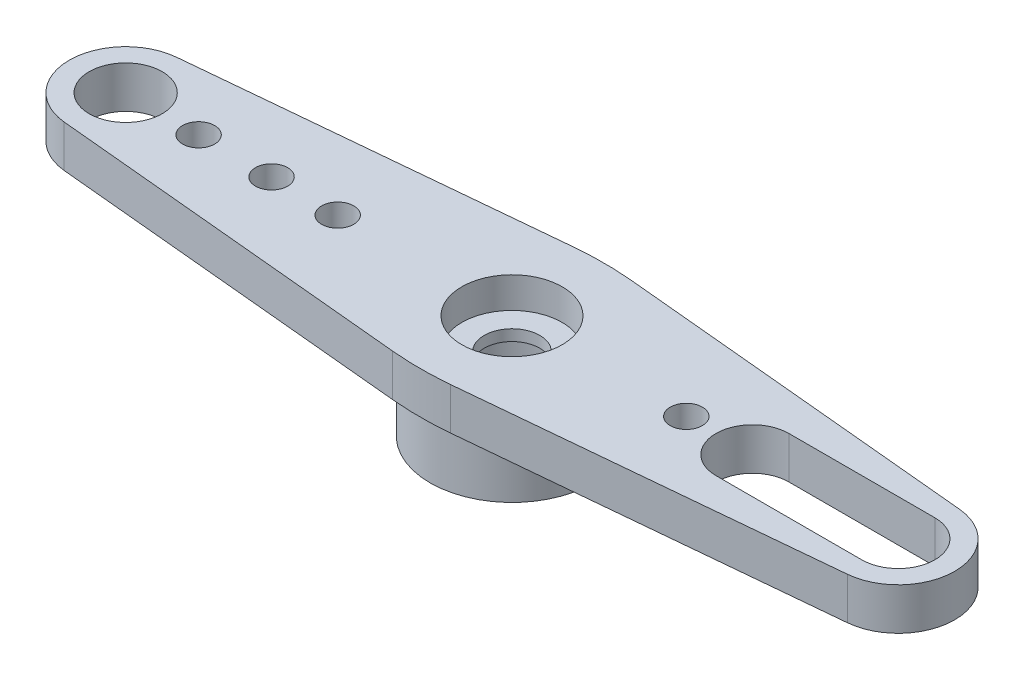
ISO-10303-21;
HEADER;
FILE_DESCRIPTION(('STEP AP214'),'2;1');
FILE_NAME('part.step','',(''),(''),'','','');
FILE_SCHEMA(('AUTOMOTIVE_DESIGN { 1 0 10303 214 1 1 1 1 }'));
ENDSEC;
DATA;
#1=APPLICATION_CONTEXT('core data for automotive mechanical design processes');
#2=APPLICATION_PROTOCOL_DEFINITION('international standard','automotive_design',2000,#1);
#3=PRODUCT_CONTEXT('',#1,'mechanical');
#4=PRODUCT('Part','Part','',(#3));
#5=PRODUCT_RELATED_PRODUCT_CATEGORY('part','',(#4));
#6=PRODUCT_DEFINITION_FORMATION('','',#4);
#7=PRODUCT_DEFINITION_CONTEXT('part definition',#1,'design');
#8=PRODUCT_DEFINITION('design','',#6,#7);
#9=PRODUCT_DEFINITION_SHAPE('','',#8);
#10=(LENGTH_UNIT() NAMED_UNIT(*) SI_UNIT(.MILLI.,.METRE.));
#11=(NAMED_UNIT(*) PLANE_ANGLE_UNIT() SI_UNIT($,.RADIAN.));
#12=(NAMED_UNIT(*) SI_UNIT($,.STERADIAN.) SOLID_ANGLE_UNIT());
#13=UNCERTAINTY_MEASURE_WITH_UNIT(LENGTH_MEASURE(1.E-05),#10,'distance_accuracy_value','');
#14=(GEOMETRIC_REPRESENTATION_CONTEXT(3) GLOBAL_UNCERTAINTY_ASSIGNED_CONTEXT((#13)) GLOBAL_UNIT_ASSIGNED_CONTEXT((#10,
#11,#12)) REPRESENTATION_CONTEXT('',''));
#15=CARTESIAN_POINT('',(0.,0.,0.));
#16=DIRECTION('',(0.,0.,1.));
#17=DIRECTION('',(1.,0.,0.));
#18=AXIS2_PLACEMENT_3D('',#15,#16,#17);
#19=CARTESIAN_POINT('',(0.,4.2672,0.));
#20=DIRECTION('',(0.,-1.,0.));
#21=DIRECTION('',(0.,0.,-1.));
#22=AXIS2_PLACEMENT_3D('',#19,#20,#21);
#23=CYLINDRICAL_SURFACE('',#22,1.143);
#24=CARTESIAN_POINT('',(0.,2.54,0.));
#25=DIRECTION('',(0.,1.,0.));
#26=DIRECTION('',(0.,0.,1.));
#27=AXIS2_PLACEMENT_3D('',#24,#25,#26);
#28=CIRCLE('',#27,1.143);
#29=CARTESIAN_POINT('',(0.,2.54,1.143));
#30=VERTEX_POINT('',#29);
#31=EDGE_CURVE('E134',#30,#30,#28,.T.);
#32=ORIENTED_EDGE('',*,*,#31,.F.);
#33=EDGE_LOOP('',(#32));
#34=FACE_BOUND('',#33,.T.);
#35=CARTESIAN_POINT('',(0.,2.9972,0.));
#36=DIRECTION('',(0.,1.,0.));
#37=DIRECTION('',(0.,0.,1.));
#38=AXIS2_PLACEMENT_3D('',#35,#36,#37);
#39=CIRCLE('',#38,1.143);
#40=CARTESIAN_POINT('',(0.,2.9972,1.143));
#41=VERTEX_POINT('',#40);
#42=EDGE_CURVE('E192',#41,#41,#39,.F.);
#43=ORIENTED_EDGE('',*,*,#42,.F.);
#44=EDGE_LOOP('',(#43));
#45=FACE_BOUND('',#44,.T.);
#46=ADVANCED_FACE('F37',(#34,#45),#23,.F.);
#47=CARTESIAN_POINT('',(0.,0.,0.));
#48=DIRECTION('',(0.,1.,0.));
#49=DIRECTION('',(0.,0.,1.));
#50=AXIS2_PLACEMENT_3D('',#47,#48,#49);
#51=PLANE('',#50);
#52=CARTESIAN_POINT('',(0.,0.,0.));
#53=DIRECTION('',(0.,1.,0.));
#54=DIRECTION('',(0.,0.,1.));
#55=AXIS2_PLACEMENT_3D('',#52,#53,#54);
#56=CIRCLE('',#55,3.3655);
#57=CARTESIAN_POINT('',(0.,0.,3.3655));
#58=VERTEX_POINT('',#57);
#59=EDGE_CURVE('E164',#58,#58,#56,.T.);
#60=ORIENTED_EDGE('',*,*,#59,.F.);
#61=EDGE_LOOP('',(#60));
#62=FACE_BOUND('',#61,.T.);
#63=CARTESIAN_POINT('',(0.,0.,0.));
#64=DIRECTION('',(0.,1.,0.));
#65=DIRECTION('',(0.,0.,1.));
#66=AXIS2_PLACEMENT_3D('',#63,#64,#65);
#67=CIRCLE('',#66,2.5);
#68=CARTESIAN_POINT('',(0.,0.,2.5));
#69=VERTEX_POINT('',#68);
#70=EDGE_CURVE('E160',#69,#69,#67,.T.);
#71=ORIENTED_EDGE('',*,*,#70,.T.);
#72=EDGE_LOOP('',(#71));
#73=FACE_BOUND('',#72,.T.);
#74=ADVANCED_FACE('F305',(#62,#73),#51,.F.);
#75=CARTESIAN_POINT('',(0.,2.54,0.));
#76=DIRECTION('',(0.,-1.,0.));
#77=DIRECTION('',(0.,0.,-1.));
#78=AXIS2_PLACEMENT_3D('',#75,#76,#77);
#79=CYLINDRICAL_SURFACE('',#78,3.3655);
#80=CARTESIAN_POINT('',(0.,2.54,0.));
#81=DIRECTION('',(0.,1.,0.));
#82=DIRECTION('',(0.,0.,1.));
#83=AXIS2_PLACEMENT_3D('',#80,#81,#82);
#84=CIRCLE('',#83,3.3655);
#85=CARTESIAN_POINT('',(0.,2.54,3.3655));
#86=VERTEX_POINT('',#85);
#87=EDGE_CURVE('E165',#86,#86,#84,.T.);
#88=ORIENTED_EDGE('',*,*,#87,.F.);
#89=EDGE_LOOP('',(#88));
#90=FACE_BOUND('',#89,.T.);
#91=ORIENTED_EDGE('',*,*,#59,.T.);
#92=EDGE_LOOP('',(#91));
#93=FACE_BOUND('',#92,.T.);
#94=ADVANCED_FACE('F311',(#90,#93),#79,.T.);
#95=CARTESIAN_POINT('',(0.,2.54,0.));
#96=DIRECTION('',(0.,-1.,0.));
#97=DIRECTION('',(0.,0.,-1.));
#98=AXIS2_PLACEMENT_3D('',#95,#96,#97);
#99=CYLINDRICAL_SURFACE('',#98,2.5);
#100=CARTESIAN_POINT('',(0.,2.54,0.));
#101=DIRECTION('',(0.,1.,0.));
#102=DIRECTION('',(0.,0.,1.));
#103=AXIS2_PLACEMENT_3D('',#100,#101,#102);
#104=CIRCLE('',#103,2.5);
#105=CARTESIAN_POINT('',(0.,2.54,2.5));
#106=VERTEX_POINT('',#105);
#107=EDGE_CURVE('E157',#106,#106,#104,.T.);
#108=ORIENTED_EDGE('',*,*,#107,.T.);
#109=EDGE_LOOP('',(#108));
#110=FACE_BOUND('',#109,.T.);
#111=ORIENTED_EDGE('',*,*,#70,.F.);
#112=EDGE_LOOP('',(#111));
#113=FACE_BOUND('',#112,.T.);
#114=ADVANCED_FACE('F363',(#110,#113),#99,.F.);
#115=CARTESIAN_POINT('',(0.,2.54,0.));
#116=DIRECTION('',(0.,1.,0.));
#117=DIRECTION('',(0.,0.,1.));
#118=AXIS2_PLACEMENT_3D('',#115,#116,#117);
#119=PLANE('',#118);
#120=ORIENTED_EDGE('',*,*,#31,.T.);
#121=EDGE_LOOP('',(#120));
#122=FACE_BOUND('',#121,.T.);
#123=ORIENTED_EDGE('',*,*,#107,.F.);
#124=EDGE_LOOP('',(#123));
#125=FACE_BOUND('',#124,.T.);
#126=ADVANCED_FACE('F299',(#122,#125),#119,.F.);
#127=CARTESIAN_POINT('',(15.875,4.2672,0.));
#128=DIRECTION('',(0.,-1.,0.));
#129=DIRECTION('',(0.,0.,-1.));
#130=AXIS2_PLACEMENT_3D('',#127,#128,#129);
#131=CYLINDRICAL_SURFACE('',#130,1.5);
#132=CARTESIAN_POINT('',(15.875,2.54,0.));
#133=DIRECTION('',(0.,1.,0.));
#134=DIRECTION('',(0.,0.,1.));
#135=AXIS2_PLACEMENT_3D('',#132,#133,#134);
#136=CIRCLE('',#135,1.5);
#137=CARTESIAN_POINT('',(15.875,2.54,1.5));
#138=VERTEX_POINT('',#137);
#139=CARTESIAN_POINT('',(15.875,2.54,-1.5));
#140=VERTEX_POINT('',#139);
#141=EDGE_CURVE('E209',#138,#140,#136,.T.);
#142=ORIENTED_EDGE('',*,*,#141,.F.);
#143=DIRECTION('',(0.,-1.,0.));
#144=VECTOR('',#143,1.);
#145=CARTESIAN_POINT('',(15.875,4.2672,1.5));
#146=LINE('',#145,#144);
#147=CARTESIAN_POINT('',(15.875,4.2672,1.5));
#148=VERTEX_POINT('',#147);
#149=EDGE_CURVE('E161',#148,#138,#146,.T.);
#150=ORIENTED_EDGE('',*,*,#149,.F.);
#151=CARTESIAN_POINT('',(15.875,4.2672,0.));
#152=DIRECTION('',(0.,1.,0.));
#153=DIRECTION('',(0.,0.,1.));
#154=AXIS2_PLACEMENT_3D('',#151,#152,#153);
#155=CIRCLE('',#154,1.5);
#156=CARTESIAN_POINT('',(15.875,4.2672,-1.5));
#157=VERTEX_POINT('',#156);
#158=EDGE_CURVE('E263',#148,#157,#155,.T.);
#159=ORIENTED_EDGE('',*,*,#158,.T.);
#160=DIRECTION('',(0.,-1.,0.));
#161=VECTOR('',#160,1.);
#162=CARTESIAN_POINT('',(15.875,4.2672,-1.5));
#163=LINE('',#162,#161);
#164=EDGE_CURVE('E149',#157,#140,#163,.T.);
#165=ORIENTED_EDGE('',*,*,#164,.T.);
#166=EDGE_LOOP('',(#142,#150,#159,#165));
#167=FACE_BOUND('',#166,.T.);
#168=ADVANCED_FACE('F342',(#167),#131,.F.);
#169=CARTESIAN_POINT('',(0.,4.2672,1.5));
#170=DIRECTION('',(0.,0.,1.));
#171=DIRECTION('',(1.,0.,0.));
#172=AXIS2_PLACEMENT_3D('',#169,#170,#171);
#173=PLANE('',#172);
#174=DIRECTION('',(-1.,0.,0.));
#175=VECTOR('',#174,1.);
#176=CARTESIAN_POINT('',(0.,2.54,1.5));
#177=LINE('',#176,#175);
#178=CARTESIAN_POINT('',(9.8806,2.54,1.5));
#179=VERTEX_POINT('',#178);
#180=EDGE_CURVE('E212',#138,#179,#177,.T.);
#181=ORIENTED_EDGE('',*,*,#180,.T.);
#182=DIRECTION('',(0.,-1.,0.));
#183=VECTOR('',#182,1.);
#184=CARTESIAN_POINT('',(9.8806,4.2672,1.5));
#185=LINE('',#184,#183);
#186=CARTESIAN_POINT('',(9.8806,4.2672,1.5));
#187=VERTEX_POINT('',#186);
#188=EDGE_CURVE('E236',#187,#179,#185,.T.);
#189=ORIENTED_EDGE('',*,*,#188,.F.);
#190=DIRECTION('',(-1.,0.,0.));
#191=VECTOR('',#190,1.);
#192=CARTESIAN_POINT('',(0.,4.2672,1.5));
#193=LINE('',#192,#191);
#194=EDGE_CURVE('E266',#148,#187,#193,.T.);
#195=ORIENTED_EDGE('',*,*,#194,.F.);
#196=ORIENTED_EDGE('',*,*,#149,.T.);
#197=EDGE_LOOP('',(#181,#189,#195,#196));
#198=FACE_BOUND('',#197,.T.);
#199=ADVANCED_FACE('F338',(#198),#173,.F.);
#200=CARTESIAN_POINT('',(9.8806,4.2672,0.));
#201=DIRECTION('',(0.,-1.,0.));
#202=DIRECTION('',(0.,0.,-1.));
#203=AXIS2_PLACEMENT_3D('',#200,#201,#202);
#204=CYLINDRICAL_SURFACE('',#203,1.5);
#205=CARTESIAN_POINT('',(9.8806,2.54,0.));
#206=DIRECTION('',(0.,1.,0.));
#207=DIRECTION('',(0.,0.,1.));
#208=AXIS2_PLACEMENT_3D('',#205,#206,#207);
#209=CIRCLE('',#208,1.5);
#210=CARTESIAN_POINT('',(9.8806,2.54,-1.5));
#211=VERTEX_POINT('',#210);
#212=EDGE_CURVE('E215',#211,#179,#209,.T.);
#213=ORIENTED_EDGE('',*,*,#212,.F.);
#214=DIRECTION('',(0.,-1.,0.));
#215=VECTOR('',#214,1.);
#216=CARTESIAN_POINT('',(9.8806,4.2672,-1.5));
#217=LINE('',#216,#215);
#218=CARTESIAN_POINT('',(9.8806,4.2672,-1.5));
#219=VERTEX_POINT('',#218);
#220=EDGE_CURVE('E151',#219,#211,#217,.T.);
#221=ORIENTED_EDGE('',*,*,#220,.F.);
#222=CARTESIAN_POINT('',(9.8806,4.2672,0.));
#223=DIRECTION('',(0.,1.,0.));
#224=DIRECTION('',(0.,0.,1.));
#225=AXIS2_PLACEMENT_3D('',#222,#223,#224);
#226=CIRCLE('',#225,1.5);
#227=EDGE_CURVE('E268',#219,#187,#226,.T.);
#228=ORIENTED_EDGE('',*,*,#227,.T.);
#229=ORIENTED_EDGE('',*,*,#188,.T.);
#230=EDGE_LOOP('',(#213,#221,#228,#229));
#231=FACE_BOUND('',#230,.T.);
#232=ADVANCED_FACE('F335',(#231),#204,.F.);
#233=CARTESIAN_POINT('',(0.356760873994165,4.2672,3.78910943647926));
#234=DIRECTION('',(-0.0937396950965555,0.,-0.995596740434201));
#235=DIRECTION('',(-0.995596740434201,0.,0.0937396950965555));
#236=AXIS2_PLACEMENT_3D('',#233,#234,#235);
#237=PLANE('',#236);
#238=DIRECTION('',(0.995596740434201,0.,-0.0937396950965555));
#239=VECTOR('',#238,1.);
#240=CARTESIAN_POINT('',(0.356760873994165,4.2672,3.78910943647926));
#241=LINE('',#240,#239);
#242=CARTESIAN_POINT('',(1.19049412772625,4.2672,3.71060988156648));
#243=VERTEX_POINT('',#242);
#244=CARTESIAN_POINT('',(16.09226517831,4.2672,2.30754434514137));
#245=VERTEX_POINT('',#244);
#246=EDGE_CURVE('E123',#243,#245,#241,.T.);
#247=ORIENTED_EDGE('',*,*,#246,.F.);
#248=DIRECTION('',(0.,-1.,0.));
#249=VECTOR('',#248,1.);
#250=CARTESIAN_POINT('',(1.19049412772625,2.54,3.71060988156648));
#251=LINE('',#250,#249);
#252=CARTESIAN_POINT('',(1.19049412772625,2.54,3.71060988156648));
#253=VERTEX_POINT('',#252);
#254=EDGE_CURVE('E45',#243,#253,#251,.T.);
#255=ORIENTED_EDGE('',*,*,#254,.T.);
#256=DIRECTION('',(0.995596740434201,0.,-0.0937396950965555));
#257=VECTOR('',#256,1.);
#258=CARTESIAN_POINT('',(0.356760873994165,2.54,3.78910943647926));
#259=LINE('',#258,#257);
#260=CARTESIAN_POINT('',(16.09226517831,2.54,2.30754434514137));
#261=VERTEX_POINT('',#260);
#262=EDGE_CURVE('E147',#253,#261,#259,.T.);
#263=ORIENTED_EDGE('',*,*,#262,.T.);
#264=DIRECTION('',(0.,-1.,0.));
#265=VECTOR('',#264,1.);
#266=CARTESIAN_POINT('',(16.09226517831,4.2672,2.30754434514137));
#267=LINE('',#266,#265);
#268=EDGE_CURVE('E140',#245,#261,#267,.T.);
#269=ORIENTED_EDGE('',*,*,#268,.F.);
#270=EDGE_LOOP('',(#247,#255,#263,#269));
#271=FACE_BOUND('',#270,.T.);
#272=ADVANCED_FACE('F145',(#271),#237,.F.);
#273=CARTESIAN_POINT('',(15.875,4.2672,0.));
#274=DIRECTION('',(0.,-1.,0.));
#275=DIRECTION('',(0.,0.,-1.));
#276=AXIS2_PLACEMENT_3D('',#273,#274,#275);
#277=CYLINDRICAL_SURFACE('',#276,2.31775);
#278=CARTESIAN_POINT('',(15.875,2.54,0.));
#279=DIRECTION('',(0.,1.,0.));
#280=DIRECTION('',(0.,0.,1.));
#281=AXIS2_PLACEMENT_3D('',#278,#279,#280);
#282=CIRCLE('',#281,2.31775);
#283=CARTESIAN_POINT('',(16.09226517831,2.54,-2.30754434514137));
#284=VERTEX_POINT('',#283);
#285=EDGE_CURVE('E186',#261,#284,#282,.T.);
#286=ORIENTED_EDGE('',*,*,#285,.T.);
#287=DIRECTION('',(0.,-1.,0.));
#288=VECTOR('',#287,1.);
#289=CARTESIAN_POINT('',(16.09226517831,4.2672,-2.30754434514137));
#290=LINE('',#289,#288);
#291=CARTESIAN_POINT('',(16.09226517831,4.2672,-2.30754434514137));
#292=VERTEX_POINT('',#291);
#293=EDGE_CURVE('E142',#292,#284,#290,.T.);
#294=ORIENTED_EDGE('',*,*,#293,.F.);
#295=CARTESIAN_POINT('',(15.875,4.2672,0.));
#296=DIRECTION('',(0.,1.,0.));
#297=DIRECTION('',(0.,0.,1.));
#298=AXIS2_PLACEMENT_3D('',#295,#296,#297);
#299=CIRCLE('',#298,2.31775);
#300=EDGE_CURVE('E128',#245,#292,#299,.T.);
#301=ORIENTED_EDGE('',*,*,#300,.F.);
#302=ORIENTED_EDGE('',*,*,#268,.T.);
#303=EDGE_LOOP('',(#286,#294,#301,#302));
#304=FACE_BOUND('',#303,.T.);
#305=ADVANCED_FACE('F139',(#304),#277,.T.);
#306=CARTESIAN_POINT('',(0.356760873994165,4.2672,-3.78910943647926));
#307=DIRECTION('',(0.0937396950965555,0.,-0.995596740434201));
#308=DIRECTION('',(-0.995596740434201,0.,-0.0937396950965555));
#309=AXIS2_PLACEMENT_3D('',#306,#307,#308);
#310=PLANE('',#309);
#311=DIRECTION('',(0.995596740434201,0.,0.0937396950965555));
#312=VECTOR('',#311,1.);
#313=CARTESIAN_POINT('',(0.356760873994165,2.54,-3.78910943647926));
#314=LINE('',#313,#312);
#315=CARTESIAN_POINT('',(1.19049412772625,2.54,-3.71060988156648));
#316=VERTEX_POINT('',#315);
#317=EDGE_CURVE('E189',#316,#284,#314,.T.);
#318=ORIENTED_EDGE('',*,*,#317,.F.);
#319=DIRECTION('',(0.,-1.,0.));
#320=VECTOR('',#319,1.);
#321=CARTESIAN_POINT('',(1.19049412772625,4.2672,-3.71060988156648));
#322=LINE('',#321,#320);
#323=CARTESIAN_POINT('',(1.19049412772625,4.2672,-3.71060988156648));
#324=VERTEX_POINT('',#323);
#325=EDGE_CURVE('E177',#316,#324,#322,.F.);
#326=ORIENTED_EDGE('',*,*,#325,.T.);
#327=DIRECTION('',(0.995596740434201,0.,0.0937396950965555));
#328=VECTOR('',#327,1.);
#329=CARTESIAN_POINT('',(0.356760873994165,4.2672,-3.78910943647926));
#330=LINE('',#329,#328);
#331=EDGE_CURVE('E143',#324,#292,#330,.T.);
#332=ORIENTED_EDGE('',*,*,#331,.T.);
#333=ORIENTED_EDGE('',*,*,#293,.T.);
#334=EDGE_LOOP('',(#318,#326,#332,#333));
#335=FACE_BOUND('',#334,.T.);
#336=ADVANCED_FACE('F355',(#335),#310,.T.);
#337=CARTESIAN_POINT('',(-0.356760873994165,4.2672,-3.78910943647926));
#338=DIRECTION('',(0.0937396950965555,0.,0.995596740434201));
#339=DIRECTION('',(0.995596740434201,0.,-0.0937396950965555));
#340=AXIS2_PLACEMENT_3D('',#337,#338,#339);
#341=PLANE('',#340);
#342=DIRECTION('',(-0.995596740434201,0.,0.0937396950965555));
#343=VECTOR('',#342,1.);
#344=CARTESIAN_POINT('',(-0.356760873994165,4.2672,-3.78910943647926));
#345=LINE('',#344,#343);
#346=CARTESIAN_POINT('',(-1.19049412772625,4.2672,-3.71060988156648));
#347=VERTEX_POINT('',#346);
#348=CARTESIAN_POINT('',(-16.09226517831,4.2672,-2.30754434514137));
#349=VERTEX_POINT('',#348);
#350=EDGE_CURVE('E254',#347,#349,#345,.T.);
#351=ORIENTED_EDGE('',*,*,#350,.F.);
#352=DIRECTION('',(0.,-1.,0.));
#353=VECTOR('',#352,1.);
#354=CARTESIAN_POINT('',(-1.19049412772625,2.54,-3.71060988156648));
#355=LINE('',#354,#353);
#356=CARTESIAN_POINT('',(-1.19049412772625,2.54,-3.71060988156648));
#357=VERTEX_POINT('',#356);
#358=EDGE_CURVE('E168',#347,#357,#355,.T.);
#359=ORIENTED_EDGE('',*,*,#358,.T.);
#360=DIRECTION('',(-0.995596740434201,0.,0.0937396950965555));
#361=VECTOR('',#360,1.);
#362=CARTESIAN_POINT('',(-0.356760873994165,2.54,-3.78910943647926));
#363=LINE('',#362,#361);
#364=CARTESIAN_POINT('',(-16.09226517831,2.54,-2.30754434514137));
#365=VERTEX_POINT('',#364);
#366=EDGE_CURVE('E199',#357,#365,#363,.T.);
#367=ORIENTED_EDGE('',*,*,#366,.T.);
#368=DIRECTION('',(0.,-1.,0.));
#369=VECTOR('',#368,1.);
#370=CARTESIAN_POINT('',(-16.09226517831,4.2672,-2.30754434514137));
#371=LINE('',#370,#369);
#372=EDGE_CURVE('E153',#349,#365,#371,.T.);
#373=ORIENTED_EDGE('',*,*,#372,.F.);
#374=EDGE_LOOP('',(#351,#359,#367,#373));
#375=FACE_BOUND('',#374,.T.);
#376=ADVANCED_FACE('F352',(#375),#341,.F.);
#377=CARTESIAN_POINT('',(-15.875,4.2672,0.));
#378=DIRECTION('',(0.,-1.,0.));
#379=DIRECTION('',(0.,0.,-1.));
#380=AXIS2_PLACEMENT_3D('',#377,#378,#379);
#381=CYLINDRICAL_SURFACE('',#380,2.31775);
#382=CARTESIAN_POINT('',(-15.875,2.54,0.));
#383=DIRECTION('',(0.,1.,0.));
#384=DIRECTION('',(0.,0.,1.));
#385=AXIS2_PLACEMENT_3D('',#382,#383,#384);
#386=CIRCLE('',#385,2.31775);
#387=CARTESIAN_POINT('',(-16.09226517831,2.54,2.30754434514137));
#388=VERTEX_POINT('',#387);
#389=EDGE_CURVE('E201',#388,#365,#386,.F.);
#390=ORIENTED_EDGE('',*,*,#389,.F.);
#391=DIRECTION('',(0.,-1.,0.));
#392=VECTOR('',#391,1.);
#393=CARTESIAN_POINT('',(-16.09226517831,4.2672,2.30754434514137));
#394=LINE('',#393,#392);
#395=CARTESIAN_POINT('',(-16.09226517831,4.2672,2.30754434514137));
#396=VERTEX_POINT('',#395);
#397=EDGE_CURVE('E239',#396,#388,#394,.T.);
#398=ORIENTED_EDGE('',*,*,#397,.F.);
#399=CARTESIAN_POINT('',(-15.875,4.2672,0.));
#400=DIRECTION('',(0.,1.,0.));
#401=DIRECTION('',(0.,0.,1.));
#402=AXIS2_PLACEMENT_3D('',#399,#400,#401);
#403=CIRCLE('',#402,2.31775);
#404=EDGE_CURVE('E249',#396,#349,#403,.F.);
#405=ORIENTED_EDGE('',*,*,#404,.T.);
#406=ORIENTED_EDGE('',*,*,#372,.T.);
#407=EDGE_LOOP('',(#390,#398,#405,#406));
#408=FACE_BOUND('',#407,.T.);
#409=ADVANCED_FACE('F246',(#408),#381,.T.);
#410=CARTESIAN_POINT('',(7.1628,4.2672,0.));
#411=DIRECTION('',(0.,-1.,0.));
#412=DIRECTION('',(0.,0.,-1.));
#413=AXIS2_PLACEMENT_3D('',#410,#411,#412);
#414=CYLINDRICAL_SURFACE('',#413,0.6604);
#415=CARTESIAN_POINT('',(7.1628,4.2672,0.));
#416=DIRECTION('',(0.,1.,0.));
#417=DIRECTION('',(0.,0.,1.));
#418=AXIS2_PLACEMENT_3D('',#415,#416,#417);
#419=CIRCLE('',#418,0.6604);
#420=CARTESIAN_POINT('',(7.1628,4.2672,0.6604));
#421=VERTEX_POINT('',#420);
#422=EDGE_CURVE('E195',#421,#421,#419,.T.);
#423=ORIENTED_EDGE('',*,*,#422,.T.);
#424=EDGE_LOOP('',(#423));
#425=FACE_BOUND('',#424,.T.);
#426=CARTESIAN_POINT('',(7.1628,2.54,0.));
#427=DIRECTION('',(0.,1.,0.));
#428=DIRECTION('',(0.,0.,1.));
#429=AXIS2_PLACEMENT_3D('',#426,#427,#428);
#430=CIRCLE('',#429,0.6604);
#431=CARTESIAN_POINT('',(7.1628,2.54,0.6604));
#432=VERTEX_POINT('',#431);
#433=EDGE_CURVE('E230',#432,#432,#430,.T.);
#434=ORIENTED_EDGE('',*,*,#433,.F.);
#435=EDGE_LOOP('',(#434));
#436=FACE_BOUND('',#435,.T.);
#437=ADVANCED_FACE('F286',(#425,#436),#414,.F.);
#438=CARTESIAN_POINT('',(-15.875,4.2672,0.));
#439=DIRECTION('',(0.,-1.,0.));
#440=DIRECTION('',(0.,0.,-1.));
#441=AXIS2_PLACEMENT_3D('',#438,#439,#440);
#442=CYLINDRICAL_SURFACE('',#441,1.5);
#443=CARTESIAN_POINT('',(-15.875,4.2672,0.));
#444=DIRECTION('',(0.,1.,0.));
#445=DIRECTION('',(0.,0.,1.));
#446=AXIS2_PLACEMENT_3D('',#443,#444,#445);
#447=CIRCLE('',#446,1.5);
#448=CARTESIAN_POINT('',(-15.875,4.2672,1.5));
#449=VERTEX_POINT('',#448);
#450=EDGE_CURVE('E279',#449,#449,#447,.F.);
#451=ORIENTED_EDGE('',*,*,#450,.F.);
#452=EDGE_LOOP('',(#451));
#453=FACE_BOUND('',#452,.T.);
#454=CARTESIAN_POINT('',(-15.875,2.54,0.));
#455=DIRECTION('',(0.,1.,0.));
#456=DIRECTION('',(0.,0.,1.));
#457=AXIS2_PLACEMENT_3D('',#454,#455,#456);
#458=CIRCLE('',#457,1.5);
#459=CARTESIAN_POINT('',(-15.875,2.54,1.5));
#460=VERTEX_POINT('',#459);
#461=EDGE_CURVE('E227',#460,#460,#458,.F.);
#462=ORIENTED_EDGE('',*,*,#461,.T.);
#463=EDGE_LOOP('',(#462));
#464=FACE_BOUND('',#463,.T.);
#465=ADVANCED_FACE('F319',(#453,#464),#442,.F.);
#466=CARTESIAN_POINT('',(-12.8778,4.2672,0.));
#467=DIRECTION('',(0.,-1.,0.));
#468=DIRECTION('',(0.,0.,-1.));
#469=AXIS2_PLACEMENT_3D('',#466,#467,#468);
#470=CYLINDRICAL_SURFACE('',#469,0.660399999999998);
#471=CARTESIAN_POINT('',(-12.8778,4.2672,0.));
#472=DIRECTION('',(0.,1.,0.));
#473=DIRECTION('',(0.,0.,1.));
#474=AXIS2_PLACEMENT_3D('',#471,#472,#473);
#475=CIRCLE('',#474,0.660399999999998);
#476=CARTESIAN_POINT('',(-12.8778,4.2672,0.660399999999998));
#477=VERTEX_POINT('',#476);
#478=EDGE_CURVE('E277',#477,#477,#475,.F.);
#479=ORIENTED_EDGE('',*,*,#478,.F.);
#480=EDGE_LOOP('',(#479));
#481=FACE_BOUND('',#480,.T.);
#482=CARTESIAN_POINT('',(-12.8778,2.54,0.));
#483=DIRECTION('',(0.,1.,0.));
#484=DIRECTION('',(0.,0.,1.));
#485=AXIS2_PLACEMENT_3D('',#482,#483,#484);
#486=CIRCLE('',#485,0.660399999999998);
#487=CARTESIAN_POINT('',(-12.8778,2.54,0.660399999999998));
#488=VERTEX_POINT('',#487);
#489=EDGE_CURVE('E224',#488,#488,#486,.F.);
#490=ORIENTED_EDGE('',*,*,#489,.T.);
#491=EDGE_LOOP('',(#490));
#492=FACE_BOUND('',#491,.T.);
#493=ADVANCED_FACE('F322',(#481,#492),#470,.F.);
#494=CARTESIAN_POINT('',(-7.1628,4.2672,0.));
#495=DIRECTION('',(0.,-1.,0.));
#496=DIRECTION('',(0.,0.,-1.));
#497=AXIS2_PLACEMENT_3D('',#494,#495,#496);
#498=CYLINDRICAL_SURFACE('',#497,0.6604);
#499=CARTESIAN_POINT('',(-7.1628,4.2672,0.));
#500=DIRECTION('',(0.,1.,0.));
#501=DIRECTION('',(0.,0.,1.));
#502=AXIS2_PLACEMENT_3D('',#499,#500,#501);
#503=CIRCLE('',#502,0.6604);
#504=CARTESIAN_POINT('',(-7.1628,4.2672,0.6604));
#505=VERTEX_POINT('',#504);
#506=EDGE_CURVE('E274',#505,#505,#503,.F.);
#507=ORIENTED_EDGE('',*,*,#506,.F.);
#508=EDGE_LOOP('',(#507));
#509=FACE_BOUND('',#508,.T.);
#510=CARTESIAN_POINT('',(-7.1628,2.54,0.));
#511=DIRECTION('',(0.,1.,0.));
#512=DIRECTION('',(0.,0.,1.));
#513=AXIS2_PLACEMENT_3D('',#510,#511,#512);
#514=CIRCLE('',#513,0.6604);
#515=CARTESIAN_POINT('',(-7.1628,2.54,0.6604));
#516=VERTEX_POINT('',#515);
#517=EDGE_CURVE('E221',#516,#516,#514,.F.);
#518=ORIENTED_EDGE('',*,*,#517,.T.);
#519=EDGE_LOOP('',(#518));
#520=FACE_BOUND('',#519,.T.);
#521=ADVANCED_FACE('F326',(#509,#520),#498,.F.);
#522=CARTESIAN_POINT('',(0.,4.2672,-1.5));
#523=DIRECTION('',(0.,0.,1.));
#524=DIRECTION('',(1.,0.,0.));
#525=AXIS2_PLACEMENT_3D('',#522,#523,#524);
#526=PLANE('',#525);
#527=DIRECTION('',(-1.,0.,0.));
#528=VECTOR('',#527,1.);
#529=CARTESIAN_POINT('',(0.,2.54,-1.5));
#530=LINE('',#529,#528);
#531=EDGE_CURVE('E218',#140,#211,#530,.T.);
#532=ORIENTED_EDGE('',*,*,#531,.F.);
#533=ORIENTED_EDGE('',*,*,#164,.F.);
#534=DIRECTION('',(-1.,0.,0.));
#535=VECTOR('',#534,1.);
#536=CARTESIAN_POINT('',(0.,4.2672,-1.5));
#537=LINE('',#536,#535);
#538=EDGE_CURVE('E271',#157,#219,#537,.T.);
#539=ORIENTED_EDGE('',*,*,#538,.T.);
#540=ORIENTED_EDGE('',*,*,#220,.T.);
#541=EDGE_LOOP('',(#532,#533,#539,#540));
#542=FACE_BOUND('',#541,.T.);
#543=ADVANCED_FACE('F330',(#542),#526,.T.);
#544=CARTESIAN_POINT('',(-9.8806,4.2672,0.));
#545=DIRECTION('',(0.,-1.,0.));
#546=DIRECTION('',(0.,0.,-1.));
#547=AXIS2_PLACEMENT_3D('',#544,#545,#546);
#548=CYLINDRICAL_SURFACE('',#547,0.6604);
#549=CARTESIAN_POINT('',(-9.8806,4.2672,0.));
#550=DIRECTION('',(0.,1.,0.));
#551=DIRECTION('',(0.,0.,1.));
#552=AXIS2_PLACEMENT_3D('',#549,#550,#551);
#553=CIRCLE('',#552,0.6604);
#554=CARTESIAN_POINT('',(-9.8806,4.2672,0.6604));
#555=VERTEX_POINT('',#554);
#556=EDGE_CURVE('E256',#555,#555,#553,.F.);
#557=ORIENTED_EDGE('',*,*,#556,.F.);
#558=EDGE_LOOP('',(#557));
#559=FACE_BOUND('',#558,.T.);
#560=CARTESIAN_POINT('',(-9.8806,2.54,0.));
#561=DIRECTION('',(0.,1.,0.));
#562=DIRECTION('',(0.,0.,1.));
#563=AXIS2_PLACEMENT_3D('',#560,#561,#562);
#564=CIRCLE('',#563,0.6604);
#565=CARTESIAN_POINT('',(-9.8806,2.54,0.6604));
#566=VERTEX_POINT('',#565);
#567=EDGE_CURVE('E206',#566,#566,#564,.F.);
#568=ORIENTED_EDGE('',*,*,#567,.T.);
#569=EDGE_LOOP('',(#568));
#570=FACE_BOUND('',#569,.T.);
#571=ADVANCED_FACE('F300',(#559,#570),#548,.F.);
#572=CARTESIAN_POINT('',(-0.356760873994165,4.2672,3.78910943647926));
#573=DIRECTION('',(-0.0937396950965555,0.,0.995596740434201));
#574=DIRECTION('',(0.995596740434201,0.,0.0937396950965555));
#575=AXIS2_PLACEMENT_3D('',#572,#573,#574);
#576=PLANE('',#575);
#577=DIRECTION('',(-0.995596740434201,0.,-0.0937396950965555));
#578=VECTOR('',#577,1.);
#579=CARTESIAN_POINT('',(-0.356760873994165,2.54,3.78910943647926));
#580=LINE('',#579,#578);
#581=CARTESIAN_POINT('',(-1.19049412772625,2.54,3.71060988156648));
#582=VERTEX_POINT('',#581);
#583=EDGE_CURVE('E204',#582,#388,#580,.T.);
#584=ORIENTED_EDGE('',*,*,#583,.F.);
#585=DIRECTION('',(0.,-1.,0.));
#586=VECTOR('',#585,1.);
#587=CARTESIAN_POINT('',(-1.19049412772625,4.2672,3.71060988156648));
#588=LINE('',#587,#586);
#589=CARTESIAN_POINT('',(-1.19049412772625,4.2672,3.71060988156648));
#590=VERTEX_POINT('',#589);
#591=EDGE_CURVE('E11',#582,#590,#588,.F.);
#592=ORIENTED_EDGE('',*,*,#591,.T.);
#593=DIRECTION('',(-0.995596740434201,0.,-0.0937396950965555));
#594=VECTOR('',#593,1.);
#595=CARTESIAN_POINT('',(-0.356760873994165,4.2672,3.78910943647926));
#596=LINE('',#595,#594);
#597=EDGE_CURVE('E253',#590,#396,#596,.T.);
#598=ORIENTED_EDGE('',*,*,#597,.T.);
#599=ORIENTED_EDGE('',*,*,#397,.T.);
#600=EDGE_LOOP('',(#584,#592,#598,#599));
#601=FACE_BOUND('',#600,.T.);
#602=ADVANCED_FACE('F252',(#601),#576,.T.);
#603=CARTESIAN_POINT('',(0.,4.2672,0.));
#604=DIRECTION('',(0.,1.,0.));
#605=DIRECTION('',(0.,0.,1.));
#606=AXIS2_PLACEMENT_3D('',#603,#604,#605);
#607=PLANE('',#606);
#608=CARTESIAN_POINT('',(0.,4.2672,0.));
#609=DIRECTION('',(0.,1.,0.));
#610=DIRECTION('',(0.,0.,1.));
#611=AXIS2_PLACEMENT_3D('',#608,#609,#610);
#612=CIRCLE('',#611,2.06375);
#613=CARTESIAN_POINT('',(0.,4.2672,2.06375));
#614=VERTEX_POINT('',#613);
#615=EDGE_CURVE('E379',#614,#614,#612,.T.);
#616=ORIENTED_EDGE('',*,*,#615,.F.);
#617=EDGE_LOOP('',(#616));
#618=FACE_BOUND('',#617,.T.);
#619=ORIENTED_EDGE('',*,*,#331,.F.);
#620=CARTESIAN_POINT('',(0.,4.2672,8.93346872194787));
#621=DIRECTION('',(0.,1.,0.));
#622=DIRECTION('',(0.,0.,1.));
#623=AXIS2_PLACEMENT_3D('',#620,#621,#622);
#624=CIRCLE('',#623,12.7);
#625=EDGE_CURVE('E180',#324,#347,#624,.T.);
#626=ORIENTED_EDGE('',*,*,#625,.T.);
#627=ORIENTED_EDGE('',*,*,#350,.T.);
#628=ORIENTED_EDGE('',*,*,#404,.F.);
#629=ORIENTED_EDGE('',*,*,#597,.F.);
#630=CARTESIAN_POINT('',(0.,4.2672,-8.93346872194787));
#631=DIRECTION('',(0.,1.,0.));
#632=DIRECTION('',(0.,0.,1.));
#633=AXIS2_PLACEMENT_3D('',#630,#631,#632);
#634=CIRCLE('',#633,12.7);
#635=EDGE_CURVE('E57',#590,#243,#634,.T.);
#636=ORIENTED_EDGE('',*,*,#635,.T.);
#637=ORIENTED_EDGE('',*,*,#246,.T.);
#638=ORIENTED_EDGE('',*,*,#300,.T.);
#639=EDGE_LOOP('',(#619,#626,#627,#628,#629,#636,#637,#638));
#640=FACE_BOUND('',#639,.T.);
#641=ORIENTED_EDGE('',*,*,#556,.T.);
#642=EDGE_LOOP('',(#641));
#643=FACE_BOUND('',#642,.T.);
#644=ORIENTED_EDGE('',*,*,#158,.F.);
#645=ORIENTED_EDGE('',*,*,#194,.T.);
#646=ORIENTED_EDGE('',*,*,#227,.F.);
#647=ORIENTED_EDGE('',*,*,#538,.F.);
#648=EDGE_LOOP('',(#644,#645,#646,#647));
#649=FACE_BOUND('',#648,.T.);
#650=ORIENTED_EDGE('',*,*,#506,.T.);
#651=EDGE_LOOP('',(#650));
#652=FACE_BOUND('',#651,.T.);
#653=ORIENTED_EDGE('',*,*,#478,.T.);
#654=EDGE_LOOP('',(#653));
#655=FACE_BOUND('',#654,.T.);
#656=ORIENTED_EDGE('',*,*,#450,.T.);
#657=EDGE_LOOP('',(#656));
#658=FACE_BOUND('',#657,.T.);
#659=ORIENTED_EDGE('',*,*,#422,.F.);
#660=EDGE_LOOP('',(#659));
#661=FACE_BOUND('',#660,.T.);
#662=ADVANCED_FACE('F126',(#618,#640,#643,#649,#652,#655,#658,#661),#607,.T.);
#663=ORIENTED_EDGE('',*,*,#87,.T.);
#664=EDGE_LOOP('',(#663));
#665=FACE_BOUND('',#664,.T.);
#666=ORIENTED_EDGE('',*,*,#366,.F.);
#667=CARTESIAN_POINT('',(0.,2.54,8.93346872194787));
#668=DIRECTION('',(0.,1.,0.));
#669=DIRECTION('',(0.,0.,1.));
#670=AXIS2_PLACEMENT_3D('',#667,#668,#669);
#671=CIRCLE('',#670,12.7);
#672=EDGE_CURVE('E175',#357,#316,#671,.F.);
#673=ORIENTED_EDGE('',*,*,#672,.T.);
#674=ORIENTED_EDGE('',*,*,#317,.T.);
#675=ORIENTED_EDGE('',*,*,#285,.F.);
#676=ORIENTED_EDGE('',*,*,#262,.F.);
#677=CARTESIAN_POINT('',(0.,2.54,-8.93346872194787));
#678=DIRECTION('',(0.,1.,0.));
#679=DIRECTION('',(0.,0.,1.));
#680=AXIS2_PLACEMENT_3D('',#677,#678,#679);
#681=CIRCLE('',#680,12.7);
#682=EDGE_CURVE('E173',#253,#582,#681,.F.);
#683=ORIENTED_EDGE('',*,*,#682,.T.);
#684=ORIENTED_EDGE('',*,*,#583,.T.);
#685=ORIENTED_EDGE('',*,*,#389,.T.);
#686=EDGE_LOOP('',(#666,#673,#674,#675,#676,#683,#684,#685));
#687=FACE_BOUND('',#686,.T.);
#688=ORIENTED_EDGE('',*,*,#567,.F.);
#689=EDGE_LOOP('',(#688));
#690=FACE_BOUND('',#689,.T.);
#691=ORIENTED_EDGE('',*,*,#141,.T.);
#692=ORIENTED_EDGE('',*,*,#531,.T.);
#693=ORIENTED_EDGE('',*,*,#212,.T.);
#694=ORIENTED_EDGE('',*,*,#180,.F.);
#695=EDGE_LOOP('',(#691,#692,#693,#694));
#696=FACE_BOUND('',#695,.T.);
#697=ORIENTED_EDGE('',*,*,#517,.F.);
#698=EDGE_LOOP('',(#697));
#699=FACE_BOUND('',#698,.T.);
#700=ORIENTED_EDGE('',*,*,#489,.F.);
#701=EDGE_LOOP('',(#700));
#702=FACE_BOUND('',#701,.T.);
#703=ORIENTED_EDGE('',*,*,#461,.F.);
#704=EDGE_LOOP('',(#703));
#705=FACE_BOUND('',#704,.T.);
#706=ORIENTED_EDGE('',*,*,#433,.T.);
#707=EDGE_LOOP('',(#706));
#708=FACE_BOUND('',#707,.T.);
#709=ADVANCED_FACE('F184',(#665,#687,#690,#696,#699,#702,#705,#708),#119,.F.);
#710=CARTESIAN_POINT('',(0.,4.2672,8.93346872194787));
#711=DIRECTION('',(0.,1.,0.));
#712=DIRECTION('',(0.,0.,1.));
#713=AXIS2_PLACEMENT_3D('',#710,#711,#712);
#714=CYLINDRICAL_SURFACE('',#713,12.7);
#715=ORIENTED_EDGE('',*,*,#625,.F.);
#716=ORIENTED_EDGE('',*,*,#325,.F.);
#717=ORIENTED_EDGE('',*,*,#672,.F.);
#718=ORIENTED_EDGE('',*,*,#358,.F.);
#719=EDGE_LOOP('',(#715,#716,#717,#718));
#720=FACE_BOUND('',#719,.T.);
#721=ADVANCED_FACE('F296',(#720),#714,.T.);
#722=CARTESIAN_POINT('',(0.,4.2672,-8.93346872194787));
#723=DIRECTION('',(0.,1.,0.));
#724=DIRECTION('',(0.,0.,1.));
#725=AXIS2_PLACEMENT_3D('',#722,#723,#724);
#726=CYLINDRICAL_SURFACE('',#725,12.7);
#727=ORIENTED_EDGE('',*,*,#635,.F.);
#728=ORIENTED_EDGE('',*,*,#591,.F.);
#729=ORIENTED_EDGE('',*,*,#682,.F.);
#730=ORIENTED_EDGE('',*,*,#254,.F.);
#731=EDGE_LOOP('',(#727,#728,#729,#730));
#732=FACE_BOUND('',#731,.T.);
#733=ADVANCED_FACE('F39',(#732),#726,.T.);
#734=CARTESIAN_POINT('',(0.,2.9972,0.));
#735=DIRECTION('',(0.,1.,0.));
#736=DIRECTION('',(0.,0.,1.));
#737=AXIS2_PLACEMENT_3D('',#734,#735,#736);
#738=CYLINDRICAL_SURFACE('',#737,2.06375);
#739=CARTESIAN_POINT('',(0.,2.9972,0.));
#740=DIRECTION('',(0.,1.,0.));
#741=DIRECTION('',(0.,0.,1.));
#742=AXIS2_PLACEMENT_3D('',#739,#740,#741);
#743=CIRCLE('',#742,2.06375);
#744=CARTESIAN_POINT('',(0.,2.9972,2.06375));
#745=VERTEX_POINT('',#744);
#746=EDGE_CURVE('E187',#745,#745,#743,.T.);
#747=ORIENTED_EDGE('',*,*,#746,.F.);
#748=EDGE_LOOP('',(#747));
#749=FACE_BOUND('',#748,.T.);
#750=ORIENTED_EDGE('',*,*,#615,.T.);
#751=EDGE_LOOP('',(#750));
#752=FACE_BOUND('',#751,.T.);
#753=ADVANCED_FACE('F374',(#749,#752),#738,.F.);
#754=CARTESIAN_POINT('',(0.,2.9972,0.));
#755=DIRECTION('',(0.,1.,0.));
#756=DIRECTION('',(0.,0.,1.));
#757=AXIS2_PLACEMENT_3D('',#754,#755,#756);
#758=PLANE('',#757);
#759=ORIENTED_EDGE('',*,*,#42,.T.);
#760=EDGE_LOOP('',(#759));
#761=FACE_BOUND('',#760,.T.);
#762=ORIENTED_EDGE('',*,*,#746,.T.);
#763=EDGE_LOOP('',(#762));
#764=FACE_BOUND('',#763,.T.);
#765=ADVANCED_FACE('F385',(#761,#764),#758,.T.);
#766=CLOSED_SHELL('',(#46,#74,#94,#114,#126,#168,#199,#232,#272,#305,#336,#376,#409,#437,#465,
#493,#521,#543,#571,#602,#662,#709,#721,#733,#753,#765));
#767=MANIFOLD_SOLID_BREP('B2',#766);
#768=ADVANCED_BREP_SHAPE_REPRESENTATION('',(#18,#767),#14);
#769=SHAPE_DEFINITION_REPRESENTATION(#9,#768);
ENDSEC;
END-ISO-10303-21;
